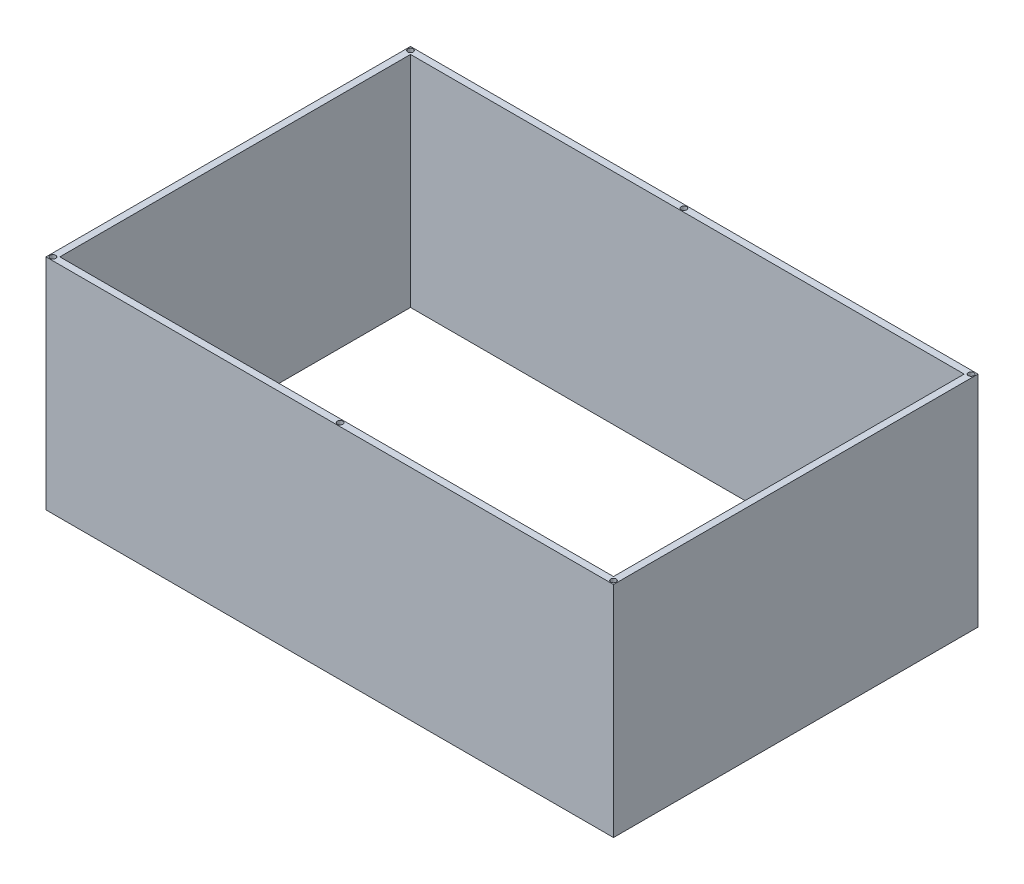
ISO-10303-21;
HEADER;
FILE_DESCRIPTION(('STEP AP214'),'2;1');
FILE_NAME('part.step','',(''),(''),'','','');
FILE_SCHEMA(('AUTOMOTIVE_DESIGN { 1 0 10303 214 1 1 1 1 }'));
ENDSEC;
DATA;
#1=APPLICATION_CONTEXT('core data for automotive mechanical design processes');
#2=APPLICATION_PROTOCOL_DEFINITION('international standard','automotive_design',2000,#1);
#3=PRODUCT_CONTEXT('',#1,'mechanical');
#4=PRODUCT('Part','Part','',(#3));
#5=PRODUCT_RELATED_PRODUCT_CATEGORY('part','',(#4));
#6=PRODUCT_DEFINITION_FORMATION('','',#4);
#7=PRODUCT_DEFINITION_CONTEXT('part definition',#1,'design');
#8=PRODUCT_DEFINITION('design','',#6,#7);
#9=PRODUCT_DEFINITION_SHAPE('','',#8);
#10=(LENGTH_UNIT() NAMED_UNIT(*) SI_UNIT(.MILLI.,.METRE.));
#11=(NAMED_UNIT(*) PLANE_ANGLE_UNIT() SI_UNIT($,.RADIAN.));
#12=(NAMED_UNIT(*) SI_UNIT($,.STERADIAN.) SOLID_ANGLE_UNIT());
#13=UNCERTAINTY_MEASURE_WITH_UNIT(LENGTH_MEASURE(1.E-05),#10,'distance_accuracy_value','');
#14=(GEOMETRIC_REPRESENTATION_CONTEXT(3) GLOBAL_UNCERTAINTY_ASSIGNED_CONTEXT((#13)) GLOBAL_UNIT_ASSIGNED_CONTEXT((#10,
#11,#12)) REPRESENTATION_CONTEXT('',''));
#15=CARTESIAN_POINT('',(0.,0.,0.));
#16=DIRECTION('',(0.,0.,1.));
#17=DIRECTION('',(1.,0.,0.));
#18=AXIS2_PLACEMENT_3D('',#15,#16,#17);
#19=CARTESIAN_POINT('',(0.,95.,0.));
#20=DIRECTION('',(0.,-1.,0.));
#21=DIRECTION('',(0.,0.,-1.));
#22=AXIS2_PLACEMENT_3D('',#19,#20,#21);
#23=PLANE('',#22);
#24=CARTESIAN_POINT('',(-121.5,95.,-77.5));
#25=DIRECTION('',(0.,1.,0.));
#26=DIRECTION('',(0.,0.,1.));
#27=AXIS2_PLACEMENT_3D('',#24,#25,#26);
#28=CIRCLE('',#27,1.19999999999999);
#29=CARTESIAN_POINT('',(-121.5,95.,-76.3));
#30=VERTEX_POINT('',#29);
#31=EDGE_CURVE('E136',#30,#30,#28,.T.);
#32=ORIENTED_EDGE('',*,*,#31,.F.);
#33=EDGE_LOOP('',(#32));
#34=FACE_BOUND('',#33,.T.);
#35=CARTESIAN_POINT('',(-121.5,95.,77.5));
#36=DIRECTION('',(0.,1.,0.));
#37=DIRECTION('',(0.,0.,1.));
#38=AXIS2_PLACEMENT_3D('',#35,#36,#37);
#39=CIRCLE('',#38,1.19999999999999);
#40=CARTESIAN_POINT('',(-121.5,95.,78.7));
#41=VERTEX_POINT('',#40);
#42=EDGE_CURVE('E135',#41,#41,#39,.T.);
#43=ORIENTED_EDGE('',*,*,#42,.F.);
#44=EDGE_LOOP('',(#43));
#45=FACE_BOUND('',#44,.T.);
#46=CARTESIAN_POINT('',(121.5,95.,77.5));
#47=DIRECTION('',(0.,1.,0.));
#48=DIRECTION('',(0.,0.,1.));
#49=AXIS2_PLACEMENT_3D('',#46,#47,#48);
#50=CIRCLE('',#49,1.19999999999999);
#51=CARTESIAN_POINT('',(121.5,95.,78.7));
#52=VERTEX_POINT('',#51);
#53=EDGE_CURVE('E149',#52,#52,#50,.T.);
#54=ORIENTED_EDGE('',*,*,#53,.F.);
#55=EDGE_LOOP('',(#54));
#56=FACE_BOUND('',#55,.T.);
#57=CARTESIAN_POINT('',(121.5,95.,-77.5));
#58=DIRECTION('',(0.,1.,0.));
#59=DIRECTION('',(0.,0.,1.));
#60=AXIS2_PLACEMENT_3D('',#57,#58,#59);
#61=CIRCLE('',#60,1.19999999999999);
#62=CARTESIAN_POINT('',(121.5,95.,-76.3));
#63=VERTEX_POINT('',#62);
#64=EDGE_CURVE('E157',#63,#63,#61,.T.);
#65=ORIENTED_EDGE('',*,*,#64,.F.);
#66=EDGE_LOOP('',(#65));
#67=FACE_BOUND('',#66,.T.);
#68=CARTESIAN_POINT('',(-3.00000000000003,95.,-77.5));
#69=DIRECTION('',(0.,1.,0.));
#70=DIRECTION('',(0.,0.,1.));
#71=AXIS2_PLACEMENT_3D('',#68,#69,#70);
#72=CIRCLE('',#71,1.19999999999999);
#73=CARTESIAN_POINT('',(-3.00000000000003,95.,-76.3));
#74=VERTEX_POINT('',#73);
#75=EDGE_CURVE('E165',#74,#74,#72,.T.);
#76=ORIENTED_EDGE('',*,*,#75,.F.);
#77=EDGE_LOOP('',(#76));
#78=FACE_BOUND('',#77,.T.);
#79=CARTESIAN_POINT('',(2.99999999999998,95.,77.5));
#80=DIRECTION('',(0.,1.,0.));
#81=DIRECTION('',(0.,0.,1.));
#82=AXIS2_PLACEMENT_3D('',#79,#80,#81);
#83=CIRCLE('',#82,1.19999999999999);
#84=CARTESIAN_POINT('',(2.99999999999998,95.,78.7));
#85=VERTEX_POINT('',#84);
#86=EDGE_CURVE('E173',#85,#85,#83,.T.);
#87=ORIENTED_EDGE('',*,*,#86,.F.);
#88=EDGE_LOOP('',(#87));
#89=FACE_BOUND('',#88,.T.);
#90=DIRECTION('',(-1.,0.,0.));
#91=VECTOR('',#90,1.);
#92=CARTESIAN_POINT('',(-123.,95.,-79.));
#93=LINE('',#92,#91);
#94=CARTESIAN_POINT('',(123.,95.,-79.));
#95=VERTEX_POINT('',#94);
#96=CARTESIAN_POINT('',(-123.,95.,-79.));
#97=VERTEX_POINT('',#96);
#98=EDGE_CURVE('E219',#95,#97,#93,.T.);
#99=ORIENTED_EDGE('',*,*,#98,.T.);
#100=DIRECTION('',(0.,0.,1.));
#101=VECTOR('',#100,1.);
#102=CARTESIAN_POINT('',(-123.,95.,-79.));
#103=LINE('',#102,#101);
#104=CARTESIAN_POINT('',(-123.,95.,79.));
#105=VERTEX_POINT('',#104);
#106=EDGE_CURVE('E223',#97,#105,#103,.T.);
#107=ORIENTED_EDGE('',*,*,#106,.T.);
#108=DIRECTION('',(1.,0.,0.));
#109=VECTOR('',#108,1.);
#110=CARTESIAN_POINT('',(-123.,95.,79.));
#111=LINE('',#110,#109);
#112=CARTESIAN_POINT('',(123.,95.,79.));
#113=VERTEX_POINT('',#112);
#114=EDGE_CURVE('E227',#105,#113,#111,.T.);
#115=ORIENTED_EDGE('',*,*,#114,.T.);
#116=DIRECTION('',(0.,0.,-1.));
#117=VECTOR('',#116,1.);
#118=CARTESIAN_POINT('',(123.,95.,-79.));
#119=LINE('',#118,#117);
#120=EDGE_CURVE('E230',#113,#95,#119,.T.);
#121=ORIENTED_EDGE('',*,*,#120,.T.);
#122=EDGE_LOOP('',(#99,#107,#115,#121));
#123=FACE_BOUND('',#122,.T.);
#124=DIRECTION('',(0.,0.,-1.));
#125=VECTOR('',#124,1.);
#126=CARTESIAN_POINT('',(120.,95.,-76.));
#127=LINE('',#126,#125);
#128=CARTESIAN_POINT('',(120.,95.,76.));
#129=VERTEX_POINT('',#128);
#130=CARTESIAN_POINT('',(120.,95.,-76.));
#131=VERTEX_POINT('',#130);
#132=EDGE_CURVE('E181',#129,#131,#127,.T.);
#133=ORIENTED_EDGE('',*,*,#132,.F.);
#134=DIRECTION('',(1.,0.,0.));
#135=VECTOR('',#134,1.);
#136=CARTESIAN_POINT('',(-120.,95.,76.));
#137=LINE('',#136,#135);
#138=CARTESIAN_POINT('',(-120.,95.,76.));
#139=VERTEX_POINT('',#138);
#140=EDGE_CURVE('E191',#139,#129,#137,.T.);
#141=ORIENTED_EDGE('',*,*,#140,.F.);
#142=DIRECTION('',(0.,0.,1.));
#143=VECTOR('',#142,1.);
#144=CARTESIAN_POINT('',(-120.,95.,-76.));
#145=LINE('',#144,#143);
#146=CARTESIAN_POINT('',(-120.,95.,-76.));
#147=VERTEX_POINT('',#146);
#148=EDGE_CURVE('E188',#147,#139,#145,.T.);
#149=ORIENTED_EDGE('',*,*,#148,.F.);
#150=DIRECTION('',(-1.,0.,0.));
#151=VECTOR('',#150,1.);
#152=CARTESIAN_POINT('',(-120.,95.,-76.));
#153=LINE('',#152,#151);
#154=EDGE_CURVE('E184',#131,#147,#153,.T.);
#155=ORIENTED_EDGE('',*,*,#154,.F.);
#156=EDGE_LOOP('',(#133,#141,#149,#155));
#157=FACE_BOUND('',#156,.T.);
#158=ADVANCED_FACE('F40',(#34,#45,#56,#67,#78,#89,#123,#157),#23,.F.);
#159=CARTESIAN_POINT('',(0.,0.,0.));
#160=DIRECTION('',(0.,-1.,0.));
#161=DIRECTION('',(0.,0.,-1.));
#162=AXIS2_PLACEMENT_3D('',#159,#160,#161);
#163=PLANE('',#162);
#164=DIRECTION('',(-1.,0.,0.));
#165=VECTOR('',#164,1.);
#166=CARTESIAN_POINT('',(-123.,0.,-79.));
#167=LINE('',#166,#165);
#168=CARTESIAN_POINT('',(123.,0.,-79.));
#169=VERTEX_POINT('',#168);
#170=CARTESIAN_POINT('',(-123.,0.,-79.));
#171=VERTEX_POINT('',#170);
#172=EDGE_CURVE('E218',#169,#171,#167,.T.);
#173=ORIENTED_EDGE('',*,*,#172,.F.);
#174=DIRECTION('',(0.,0.,-1.));
#175=VECTOR('',#174,1.);
#176=CARTESIAN_POINT('',(123.,0.,-79.));
#177=LINE('',#176,#175);
#178=CARTESIAN_POINT('',(123.,0.,79.));
#179=VERTEX_POINT('',#178);
#180=EDGE_CURVE('E224',#179,#169,#177,.T.);
#181=ORIENTED_EDGE('',*,*,#180,.F.);
#182=DIRECTION('',(1.,0.,0.));
#183=VECTOR('',#182,1.);
#184=CARTESIAN_POINT('',(-123.,0.,79.));
#185=LINE('',#184,#183);
#186=CARTESIAN_POINT('',(-123.,0.,79.));
#187=VERTEX_POINT('',#186);
#188=EDGE_CURVE('E240',#187,#179,#185,.T.);
#189=ORIENTED_EDGE('',*,*,#188,.F.);
#190=DIRECTION('',(0.,0.,1.));
#191=VECTOR('',#190,1.);
#192=CARTESIAN_POINT('',(-123.,0.,-79.));
#193=LINE('',#192,#191);
#194=EDGE_CURVE('E237',#171,#187,#193,.T.);
#195=ORIENTED_EDGE('',*,*,#194,.F.);
#196=EDGE_LOOP('',(#173,#181,#189,#195));
#197=FACE_BOUND('',#196,.T.);
#198=DIRECTION('',(1.,0.,0.));
#199=VECTOR('',#198,1.);
#200=CARTESIAN_POINT('',(-120.,0.,76.));
#201=LINE('',#200,#199);
#202=CARTESIAN_POINT('',(-120.,0.,76.));
#203=VERTEX_POINT('',#202);
#204=CARTESIAN_POINT('',(120.,0.,76.));
#205=VERTEX_POINT('',#204);
#206=EDGE_CURVE('E185',#203,#205,#201,.T.);
#207=ORIENTED_EDGE('',*,*,#206,.T.);
#208=DIRECTION('',(0.,0.,-1.));
#209=VECTOR('',#208,1.);
#210=CARTESIAN_POINT('',(120.,0.,-76.));
#211=LINE('',#210,#209);
#212=CARTESIAN_POINT('',(120.,0.,-76.));
#213=VERTEX_POINT('',#212);
#214=EDGE_CURVE('E64',#205,#213,#211,.T.);
#215=ORIENTED_EDGE('',*,*,#214,.T.);
#216=DIRECTION('',(-1.,0.,0.));
#217=VECTOR('',#216,1.);
#218=CARTESIAN_POINT('',(-120.,0.,-76.));
#219=LINE('',#218,#217);
#220=CARTESIAN_POINT('',(-120.,0.,-76.));
#221=VERTEX_POINT('',#220);
#222=EDGE_CURVE('E197',#213,#221,#219,.T.);
#223=ORIENTED_EDGE('',*,*,#222,.T.);
#224=DIRECTION('',(0.,0.,1.));
#225=VECTOR('',#224,1.);
#226=CARTESIAN_POINT('',(-120.,0.,-76.));
#227=LINE('',#226,#225);
#228=EDGE_CURVE('E201',#221,#203,#227,.T.);
#229=ORIENTED_EDGE('',*,*,#228,.T.);
#230=EDGE_LOOP('',(#207,#215,#223,#229));
#231=FACE_BOUND('',#230,.T.);
#232=ADVANCED_FACE('F263',(#197,#231),#163,.T.);
#233=CARTESIAN_POINT('',(-123.,95.,-79.));
#234=DIRECTION('',(0.,0.,1.));
#235=DIRECTION('',(1.,0.,0.));
#236=AXIS2_PLACEMENT_3D('',#233,#234,#235);
#237=PLANE('',#236);
#238=ORIENTED_EDGE('',*,*,#172,.T.);
#239=DIRECTION('',(0.,-1.,0.));
#240=VECTOR('',#239,1.);
#241=CARTESIAN_POINT('',(-123.,95.,-79.));
#242=LINE('',#241,#240);
#243=EDGE_CURVE('E11',#97,#171,#242,.T.);
#244=ORIENTED_EDGE('',*,*,#243,.F.);
#245=ORIENTED_EDGE('',*,*,#98,.F.);
#246=DIRECTION('',(0.,-1.,0.));
#247=VECTOR('',#246,1.);
#248=CARTESIAN_POINT('',(123.,95.,-79.));
#249=LINE('',#248,#247);
#250=EDGE_CURVE('E233',#95,#169,#249,.T.);
#251=ORIENTED_EDGE('',*,*,#250,.T.);
#252=EDGE_LOOP('',(#238,#244,#245,#251));
#253=FACE_BOUND('',#252,.T.);
#254=ADVANCED_FACE('F42',(#253),#237,.F.);
#255=CARTESIAN_POINT('',(-123.,95.,-79.));
#256=DIRECTION('',(1.,0.,0.));
#257=DIRECTION('',(0.,0.,-1.));
#258=AXIS2_PLACEMENT_3D('',#255,#256,#257);
#259=PLANE('',#258);
#260=ORIENTED_EDGE('',*,*,#194,.T.);
#261=DIRECTION('',(0.,-1.,0.));
#262=VECTOR('',#261,1.);
#263=CARTESIAN_POINT('',(-123.,95.,79.));
#264=LINE('',#263,#262);
#265=EDGE_CURVE('E49',#105,#187,#264,.T.);
#266=ORIENTED_EDGE('',*,*,#265,.F.);
#267=ORIENTED_EDGE('',*,*,#106,.F.);
#268=ORIENTED_EDGE('',*,*,#243,.T.);
#269=EDGE_LOOP('',(#260,#266,#267,#268));
#270=FACE_BOUND('',#269,.T.);
#271=ADVANCED_FACE('F274',(#270),#259,.F.);
#272=CARTESIAN_POINT('',(-123.,95.,79.));
#273=DIRECTION('',(0.,0.,-1.));
#274=DIRECTION('',(-1.,0.,0.));
#275=AXIS2_PLACEMENT_3D('',#272,#273,#274);
#276=PLANE('',#275);
#277=ORIENTED_EDGE('',*,*,#188,.T.);
#278=DIRECTION('',(0.,-1.,0.));
#279=VECTOR('',#278,1.);
#280=CARTESIAN_POINT('',(123.,95.,79.));
#281=LINE('',#280,#279);
#282=EDGE_CURVE('E248',#113,#179,#281,.T.);
#283=ORIENTED_EDGE('',*,*,#282,.F.);
#284=ORIENTED_EDGE('',*,*,#114,.F.);
#285=ORIENTED_EDGE('',*,*,#265,.T.);
#286=EDGE_LOOP('',(#277,#283,#284,#285));
#287=FACE_BOUND('',#286,.T.);
#288=ADVANCED_FACE('F257',(#287),#276,.F.);
#289=CARTESIAN_POINT('',(123.,95.,-79.));
#290=DIRECTION('',(-1.,0.,0.));
#291=DIRECTION('',(0.,0.,1.));
#292=AXIS2_PLACEMENT_3D('',#289,#290,#291);
#293=PLANE('',#292);
#294=ORIENTED_EDGE('',*,*,#180,.T.);
#295=ORIENTED_EDGE('',*,*,#250,.F.);
#296=ORIENTED_EDGE('',*,*,#120,.F.);
#297=ORIENTED_EDGE('',*,*,#282,.T.);
#298=EDGE_LOOP('',(#294,#295,#296,#297));
#299=FACE_BOUND('',#298,.T.);
#300=ADVANCED_FACE('F267',(#299),#293,.F.);
#301=CARTESIAN_POINT('',(120.,95.,-76.));
#302=DIRECTION('',(-1.,0.,0.));
#303=DIRECTION('',(0.,0.,1.));
#304=AXIS2_PLACEMENT_3D('',#301,#302,#303);
#305=PLANE('',#304);
#306=ORIENTED_EDGE('',*,*,#214,.F.);
#307=DIRECTION('',(0.,-1.,0.));
#308=VECTOR('',#307,1.);
#309=CARTESIAN_POINT('',(120.,95.,76.));
#310=LINE('',#309,#308);
#311=EDGE_CURVE('E194',#129,#205,#310,.T.);
#312=ORIENTED_EDGE('',*,*,#311,.F.);
#313=ORIENTED_EDGE('',*,*,#132,.T.);
#314=DIRECTION('',(0.,-1.,0.));
#315=VECTOR('',#314,1.);
#316=CARTESIAN_POINT('',(120.,95.,-76.));
#317=LINE('',#316,#315);
#318=EDGE_CURVE('E215',#131,#213,#317,.T.);
#319=ORIENTED_EDGE('',*,*,#318,.T.);
#320=EDGE_LOOP('',(#306,#312,#313,#319));
#321=FACE_BOUND('',#320,.T.);
#322=ADVANCED_FACE('F291',(#321),#305,.T.);
#323=CARTESIAN_POINT('',(-120.,95.,-76.));
#324=DIRECTION('',(0.,0.,1.));
#325=DIRECTION('',(1.,0.,0.));
#326=AXIS2_PLACEMENT_3D('',#323,#324,#325);
#327=PLANE('',#326);
#328=ORIENTED_EDGE('',*,*,#222,.F.);
#329=ORIENTED_EDGE('',*,*,#318,.F.);
#330=ORIENTED_EDGE('',*,*,#154,.T.);
#331=DIRECTION('',(0.,-1.,0.));
#332=VECTOR('',#331,1.);
#333=CARTESIAN_POINT('',(-120.,95.,-76.));
#334=LINE('',#333,#332);
#335=EDGE_CURVE('E212',#147,#221,#334,.T.);
#336=ORIENTED_EDGE('',*,*,#335,.T.);
#337=EDGE_LOOP('',(#328,#329,#330,#336));
#338=FACE_BOUND('',#337,.T.);
#339=ADVANCED_FACE('F298',(#338),#327,.T.);
#340=CARTESIAN_POINT('',(-120.,95.,-76.));
#341=DIRECTION('',(1.,0.,0.));
#342=DIRECTION('',(0.,0.,-1.));
#343=AXIS2_PLACEMENT_3D('',#340,#341,#342);
#344=PLANE('',#343);
#345=ORIENTED_EDGE('',*,*,#228,.F.);
#346=ORIENTED_EDGE('',*,*,#335,.F.);
#347=ORIENTED_EDGE('',*,*,#148,.T.);
#348=DIRECTION('',(0.,-1.,0.));
#349=VECTOR('',#348,1.);
#350=CARTESIAN_POINT('',(-120.,95.,76.));
#351=LINE('',#350,#349);
#352=EDGE_CURVE('E56',#139,#203,#351,.T.);
#353=ORIENTED_EDGE('',*,*,#352,.T.);
#354=EDGE_LOOP('',(#345,#346,#347,#353));
#355=FACE_BOUND('',#354,.T.);
#356=ADVANCED_FACE('F302',(#355),#344,.T.);
#357=CARTESIAN_POINT('',(-120.,95.,76.));
#358=DIRECTION('',(0.,0.,-1.));
#359=DIRECTION('',(-1.,0.,0.));
#360=AXIS2_PLACEMENT_3D('',#357,#358,#359);
#361=PLANE('',#360);
#362=ORIENTED_EDGE('',*,*,#206,.F.);
#363=ORIENTED_EDGE('',*,*,#352,.F.);
#364=ORIENTED_EDGE('',*,*,#140,.T.);
#365=ORIENTED_EDGE('',*,*,#311,.T.);
#366=EDGE_LOOP('',(#362,#363,#364,#365));
#367=FACE_BOUND('',#366,.T.);
#368=ADVANCED_FACE('F307',(#367),#361,.T.);
#369=CARTESIAN_POINT('',(2.99999999999998,92.,77.5));
#370=DIRECTION('',(0.,1.,0.));
#371=DIRECTION('',(0.,0.,1.));
#372=AXIS2_PLACEMENT_3D('',#369,#370,#371);
#373=CONICAL_SURFACE('',#372,1.2,1.02974425867666);
#374=CARTESIAN_POINT('',(2.99999999999997,91.2789672571669,77.5));
#375=VERTEX_POINT('',#374);
#376=VERTEX_LOOP('',#375);
#377=FACE_BOUND('',#376,.T.);
#378=CARTESIAN_POINT('',(2.99999999999998,92.,77.5));
#379=DIRECTION('',(0.,1.,0.));
#380=DIRECTION('',(0.,0.,1.));
#381=AXIS2_PLACEMENT_3D('',#378,#379,#380);
#382=CIRCLE('',#381,1.2);
#383=CARTESIAN_POINT('',(2.99999999999998,92.,78.7));
#384=VERTEX_POINT('',#383);
#385=EDGE_CURVE('E177',#384,#384,#382,.T.);
#386=ORIENTED_EDGE('',*,*,#385,.T.);
#387=EDGE_LOOP('',(#386));
#388=FACE_BOUND('',#387,.T.);
#389=ADVANCED_FACE('F313',(#377,#388),#373,.F.);
#390=CARTESIAN_POINT('',(2.99999999999998,95.,77.5));
#391=DIRECTION('',(0.,1.,0.));
#392=DIRECTION('',(0.,0.,1.));
#393=AXIS2_PLACEMENT_3D('',#390,#391,#392);
#394=CYLINDRICAL_SURFACE('',#393,1.19999999999999);
#395=ORIENTED_EDGE('',*,*,#385,.F.);
#396=EDGE_LOOP('',(#395));
#397=FACE_BOUND('',#396,.T.);
#398=ORIENTED_EDGE('',*,*,#86,.T.);
#399=EDGE_LOOP('',(#398));
#400=FACE_BOUND('',#399,.T.);
#401=ADVANCED_FACE('F316',(#397,#400),#394,.F.);
#402=CARTESIAN_POINT('',(-3.00000000000003,92.,-77.5));
#403=DIRECTION('',(0.,1.,0.));
#404=DIRECTION('',(0.,0.,1.));
#405=AXIS2_PLACEMENT_3D('',#402,#403,#404);
#406=CONICAL_SURFACE('',#405,1.2,1.02974425867666);
#407=CARTESIAN_POINT('',(-3.00000000000003,91.2789672571669,-77.5));
#408=VERTEX_POINT('',#407);
#409=VERTEX_LOOP('',#408);
#410=FACE_BOUND('',#409,.T.);
#411=CARTESIAN_POINT('',(-3.00000000000003,92.,-77.5));
#412=DIRECTION('',(0.,1.,0.));
#413=DIRECTION('',(0.,0.,1.));
#414=AXIS2_PLACEMENT_3D('',#411,#412,#413);
#415=CIRCLE('',#414,1.2);
#416=CARTESIAN_POINT('',(-3.00000000000003,92.,-76.3));
#417=VERTEX_POINT('',#416);
#418=EDGE_CURVE('E169',#417,#417,#415,.T.);
#419=ORIENTED_EDGE('',*,*,#418,.T.);
#420=EDGE_LOOP('',(#419));
#421=FACE_BOUND('',#420,.T.);
#422=ADVANCED_FACE('F320',(#410,#421),#406,.F.);
#423=CARTESIAN_POINT('',(-3.00000000000003,95.,-77.5));
#424=DIRECTION('',(0.,1.,0.));
#425=DIRECTION('',(0.,0.,1.));
#426=AXIS2_PLACEMENT_3D('',#423,#424,#425);
#427=CYLINDRICAL_SURFACE('',#426,1.19999999999999);
#428=ORIENTED_EDGE('',*,*,#418,.F.);
#429=EDGE_LOOP('',(#428));
#430=FACE_BOUND('',#429,.T.);
#431=ORIENTED_EDGE('',*,*,#75,.T.);
#432=EDGE_LOOP('',(#431));
#433=FACE_BOUND('',#432,.T.);
#434=ADVANCED_FACE('F324',(#430,#433),#427,.F.);
#435=CARTESIAN_POINT('',(121.5,92.,-77.5));
#436=DIRECTION('',(0.,1.,0.));
#437=DIRECTION('',(0.,0.,1.));
#438=AXIS2_PLACEMENT_3D('',#435,#436,#437);
#439=CONICAL_SURFACE('',#438,1.19999999999999,1.02974425867665);
#440=CARTESIAN_POINT('',(121.5,91.2789672571669,-77.5));
#441=VERTEX_POINT('',#440);
#442=VERTEX_LOOP('',#441);
#443=FACE_BOUND('',#442,.T.);
#444=CARTESIAN_POINT('',(121.5,92.,-77.5));
#445=DIRECTION('',(0.,1.,0.));
#446=DIRECTION('',(0.,0.,1.));
#447=AXIS2_PLACEMENT_3D('',#444,#445,#446);
#448=CIRCLE('',#447,1.19999999999999);
#449=CARTESIAN_POINT('',(121.5,92.,-76.3));
#450=VERTEX_POINT('',#449);
#451=EDGE_CURVE('E161',#450,#450,#448,.T.);
#452=ORIENTED_EDGE('',*,*,#451,.T.);
#453=EDGE_LOOP('',(#452));
#454=FACE_BOUND('',#453,.T.);
#455=ADVANCED_FACE('F328',(#443,#454),#439,.F.);
#456=CARTESIAN_POINT('',(121.5,95.,-77.5));
#457=DIRECTION('',(0.,1.,0.));
#458=DIRECTION('',(0.,0.,1.));
#459=AXIS2_PLACEMENT_3D('',#456,#457,#458);
#460=CYLINDRICAL_SURFACE('',#459,1.19999999999999);
#461=ORIENTED_EDGE('',*,*,#451,.F.);
#462=EDGE_LOOP('',(#461));
#463=FACE_BOUND('',#462,.T.);
#464=ORIENTED_EDGE('',*,*,#64,.T.);
#465=EDGE_LOOP('',(#464));
#466=FACE_BOUND('',#465,.T.);
#467=ADVANCED_FACE('F332',(#463,#466),#460,.F.);
#468=CARTESIAN_POINT('',(121.5,92.,77.5));
#469=DIRECTION('',(0.,1.,0.));
#470=DIRECTION('',(0.,0.,1.));
#471=AXIS2_PLACEMENT_3D('',#468,#469,#470);
#472=CONICAL_SURFACE('',#471,1.19999999999999,1.02974425867665);
#473=CARTESIAN_POINT('',(121.5,91.2789672571669,77.5));
#474=VERTEX_POINT('',#473);
#475=VERTEX_LOOP('',#474);
#476=FACE_BOUND('',#475,.T.);
#477=CARTESIAN_POINT('',(121.5,92.,77.5));
#478=DIRECTION('',(0.,1.,0.));
#479=DIRECTION('',(0.,0.,1.));
#480=AXIS2_PLACEMENT_3D('',#477,#478,#479);
#481=CIRCLE('',#480,1.19999999999999);
#482=CARTESIAN_POINT('',(121.5,92.,78.7));
#483=VERTEX_POINT('',#482);
#484=EDGE_CURVE('E153',#483,#483,#481,.T.);
#485=ORIENTED_EDGE('',*,*,#484,.T.);
#486=EDGE_LOOP('',(#485));
#487=FACE_BOUND('',#486,.T.);
#488=ADVANCED_FACE('F336',(#476,#487),#472,.F.);
#489=CARTESIAN_POINT('',(121.5,95.,77.5));
#490=DIRECTION('',(0.,1.,0.));
#491=DIRECTION('',(0.,0.,1.));
#492=AXIS2_PLACEMENT_3D('',#489,#490,#491);
#493=CYLINDRICAL_SURFACE('',#492,1.19999999999999);
#494=ORIENTED_EDGE('',*,*,#484,.F.);
#495=EDGE_LOOP('',(#494));
#496=FACE_BOUND('',#495,.T.);
#497=ORIENTED_EDGE('',*,*,#53,.T.);
#498=EDGE_LOOP('',(#497));
#499=FACE_BOUND('',#498,.T.);
#500=ADVANCED_FACE('F340',(#496,#499),#493,.F.);
#501=CARTESIAN_POINT('',(-121.5,92.,77.5));
#502=DIRECTION('',(0.,1.,0.));
#503=DIRECTION('',(0.,0.,1.));
#504=AXIS2_PLACEMENT_3D('',#501,#502,#503);
#505=CONICAL_SURFACE('',#504,1.19999999999999,1.02974425867665);
#506=CARTESIAN_POINT('',(-121.5,91.2789672571669,77.5));
#507=VERTEX_POINT('',#506);
#508=VERTEX_LOOP('',#507);
#509=FACE_BOUND('',#508,.T.);
#510=CARTESIAN_POINT('',(-121.5,92.,77.5));
#511=DIRECTION('',(0.,1.,0.));
#512=DIRECTION('',(0.,0.,1.));
#513=AXIS2_PLACEMENT_3D('',#510,#511,#512);
#514=CIRCLE('',#513,1.19999999999999);
#515=CARTESIAN_POINT('',(-121.5,92.,78.7));
#516=VERTEX_POINT('',#515);
#517=EDGE_CURVE('E141',#516,#516,#514,.T.);
#518=ORIENTED_EDGE('',*,*,#517,.T.);
#519=EDGE_LOOP('',(#518));
#520=FACE_BOUND('',#519,.T.);
#521=ADVANCED_FACE('F344',(#509,#520),#505,.F.);
#522=CARTESIAN_POINT('',(-121.5,95.,77.5));
#523=DIRECTION('',(0.,1.,0.));
#524=DIRECTION('',(0.,0.,1.));
#525=AXIS2_PLACEMENT_3D('',#522,#523,#524);
#526=CYLINDRICAL_SURFACE('',#525,1.19999999999999);
#527=ORIENTED_EDGE('',*,*,#517,.F.);
#528=EDGE_LOOP('',(#527));
#529=FACE_BOUND('',#528,.T.);
#530=ORIENTED_EDGE('',*,*,#42,.T.);
#531=EDGE_LOOP('',(#530));
#532=FACE_BOUND('',#531,.T.);
#533=ADVANCED_FACE('F128',(#529,#532),#526,.F.);
#534=CARTESIAN_POINT('',(-121.5,92.,-77.5));
#535=DIRECTION('',(0.,1.,0.));
#536=DIRECTION('',(0.,0.,1.));
#537=AXIS2_PLACEMENT_3D('',#534,#535,#536);
#538=CONICAL_SURFACE('',#537,1.19999999999999,1.02974425867665);
#539=CARTESIAN_POINT('',(-121.5,91.2789672571669,-77.5));
#540=VERTEX_POINT('',#539);
#541=VERTEX_LOOP('',#540);
#542=FACE_BOUND('',#541,.T.);
#543=CARTESIAN_POINT('',(-121.5,92.,-77.5));
#544=DIRECTION('',(0.,1.,0.));
#545=DIRECTION('',(0.,0.,1.));
#546=AXIS2_PLACEMENT_3D('',#543,#544,#545);
#547=CIRCLE('',#546,1.19999999999999);
#548=CARTESIAN_POINT('',(-121.5,92.,-76.3));
#549=VERTEX_POINT('',#548);
#550=EDGE_CURVE('E132',#549,#549,#547,.T.);
#551=ORIENTED_EDGE('',*,*,#550,.T.);
#552=EDGE_LOOP('',(#551));
#553=FACE_BOUND('',#552,.T.);
#554=ADVANCED_FACE('F124',(#542,#553),#538,.F.);
#555=CARTESIAN_POINT('',(-121.5,95.,-77.5));
#556=DIRECTION('',(0.,1.,0.));
#557=DIRECTION('',(0.,0.,1.));
#558=AXIS2_PLACEMENT_3D('',#555,#556,#557);
#559=CYLINDRICAL_SURFACE('',#558,1.19999999999999);
#560=ORIENTED_EDGE('',*,*,#550,.F.);
#561=EDGE_LOOP('',(#560));
#562=FACE_BOUND('',#561,.T.);
#563=ORIENTED_EDGE('',*,*,#31,.T.);
#564=EDGE_LOOP('',(#563));
#565=FACE_BOUND('',#564,.T.);
#566=ADVANCED_FACE('F127',(#562,#565),#559,.F.);
#567=CLOSED_SHELL('',(#158,#232,#254,#271,#288,#300,#322,#339,#356,#368,#389,#401,#422,#434,
#455,#467,#488,#500,#521,#533,#554,#566));
#568=MANIFOLD_SOLID_BREP('B2',#567);
#569=ADVANCED_BREP_SHAPE_REPRESENTATION('',(#18,#568),#14);
#570=SHAPE_DEFINITION_REPRESENTATION(#9,#569);
ENDSEC;
END-ISO-10303-21;
